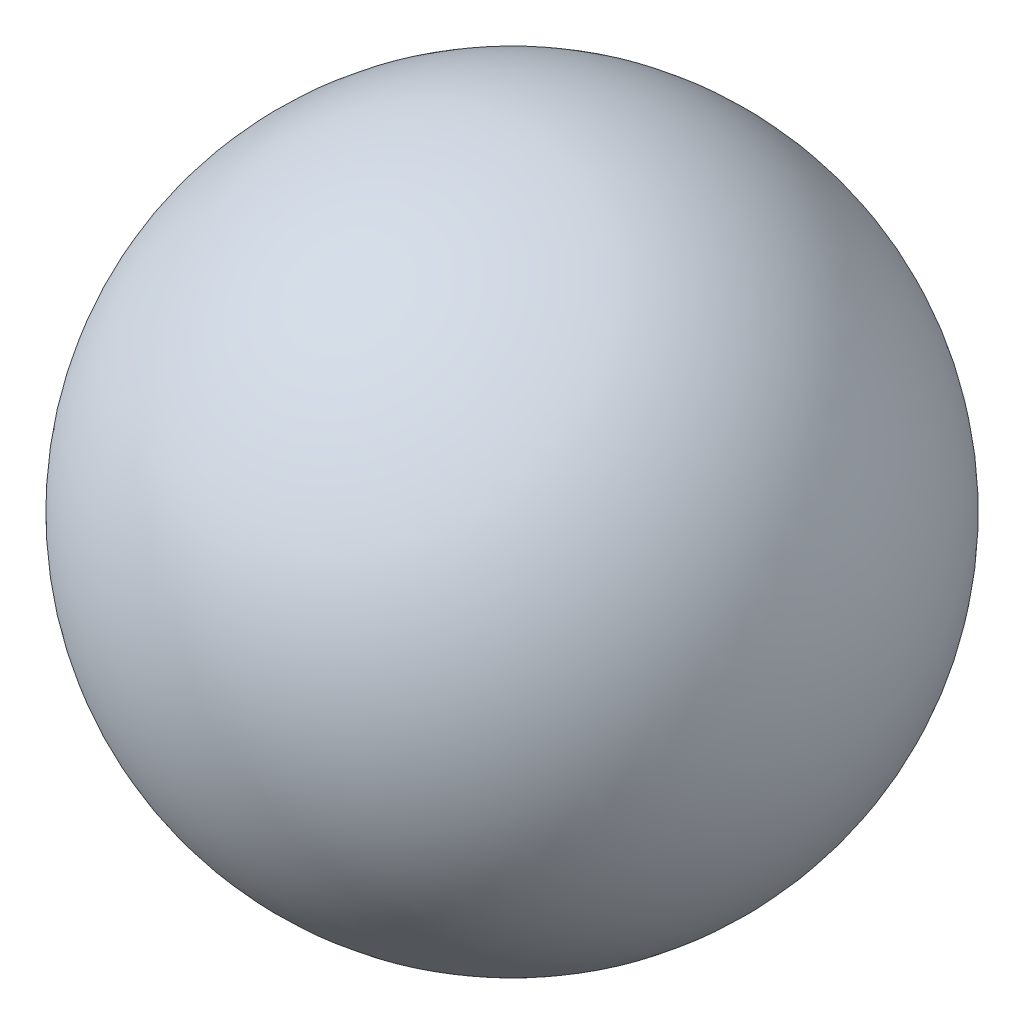
ISO-10303-21;
HEADER;
FILE_DESCRIPTION(('STEP AP214'),'2;1');
FILE_NAME('part.step','',(''),(''),'','','');
FILE_SCHEMA(('AUTOMOTIVE_DESIGN { 1 0 10303 214 1 1 1 1 }'));
ENDSEC;
DATA;
#1=APPLICATION_CONTEXT('core data for automotive mechanical design processes');
#2=APPLICATION_PROTOCOL_DEFINITION('international standard','automotive_design',2000,#1);
#3=PRODUCT_CONTEXT('',#1,'mechanical');
#4=PRODUCT('Part','Part','',(#3));
#5=PRODUCT_RELATED_PRODUCT_CATEGORY('part','',(#4));
#6=PRODUCT_DEFINITION_FORMATION('','',#4);
#7=PRODUCT_DEFINITION_CONTEXT('part definition',#1,'design');
#8=PRODUCT_DEFINITION('design','',#6,#7);
#9=PRODUCT_DEFINITION_SHAPE('','',#8);
#10=(LENGTH_UNIT() NAMED_UNIT(*) SI_UNIT(.MILLI.,.METRE.));
#11=(NAMED_UNIT(*) PLANE_ANGLE_UNIT() SI_UNIT($,.RADIAN.));
#12=(NAMED_UNIT(*) SI_UNIT($,.STERADIAN.) SOLID_ANGLE_UNIT());
#13=UNCERTAINTY_MEASURE_WITH_UNIT(LENGTH_MEASURE(1.E-05),#10,'distance_accuracy_value','');
#14=(GEOMETRIC_REPRESENTATION_CONTEXT(3) GLOBAL_UNCERTAINTY_ASSIGNED_CONTEXT((#13)) GLOBAL_UNIT_ASSIGNED_CONTEXT((#10,
#11,#12)) REPRESENTATION_CONTEXT('',''));
#15=CARTESIAN_POINT('',(0.,0.,0.));
#16=DIRECTION('',(0.,0.,1.));
#17=DIRECTION('',(1.,0.,0.));
#18=AXIS2_PLACEMENT_3D('',#15,#16,#17);
#19=CARTESIAN_POINT('',(0.,0.,0.));
#20=DIRECTION('',(0.,1.,0.));
#21=DIRECTION('',(1.,0.,0.));
#22=AXIS2_PLACEMENT_3D('',#19,#20,#21);
#23=SPHERICAL_SURFACE('',#22,0.625);
#24=CARTESIAN_POINT('',(0.,0.625,0.));
#25=VERTEX_POINT('',#24);
#26=VERTEX_LOOP('',#25);
#27=FACE_BOUND('',#26,.T.);
#28=ADVANCED_FACE('F33',(#27),#23,.T.);
#29=CLOSED_SHELL('',(#28));
#30=MANIFOLD_SOLID_BREP('B2',#29);
#31=ADVANCED_BREP_SHAPE_REPRESENTATION('',(#18,#30),#14);
#32=SHAPE_DEFINITION_REPRESENTATION(#9,#31);
ENDSEC;
END-ISO-10303-21;
